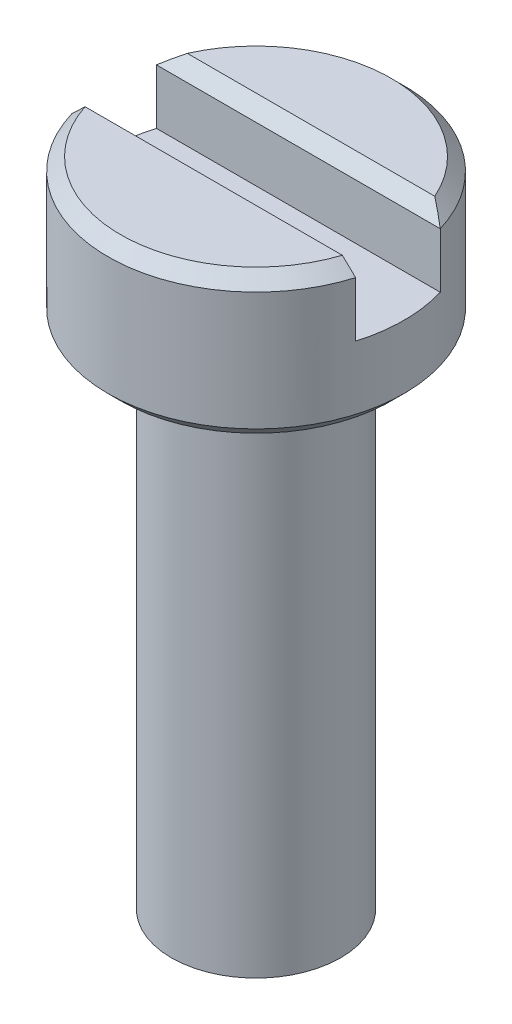
ISO-10303-21;
HEADER;
FILE_DESCRIPTION(('STEP AP214'),'2;1');
FILE_NAME('part.step','',(''),(''),'','','');
FILE_SCHEMA(('AUTOMOTIVE_DESIGN { 1 0 10303 214 1 1 1 1 }'));
ENDSEC;
DATA;
#1=APPLICATION_CONTEXT('core data for automotive mechanical design processes');
#2=APPLICATION_PROTOCOL_DEFINITION('international standard','automotive_design',2000,#1);
#3=PRODUCT_CONTEXT('',#1,'mechanical');
#4=PRODUCT('Part','Part','',(#3));
#5=PRODUCT_RELATED_PRODUCT_CATEGORY('part','',(#4));
#6=PRODUCT_DEFINITION_FORMATION('','',#4);
#7=PRODUCT_DEFINITION_CONTEXT('part definition',#1,'design');
#8=PRODUCT_DEFINITION('design','',#6,#7);
#9=PRODUCT_DEFINITION_SHAPE('','',#8);
#10=(LENGTH_UNIT() NAMED_UNIT(*) SI_UNIT(.MILLI.,.METRE.));
#11=(NAMED_UNIT(*) PLANE_ANGLE_UNIT() SI_UNIT($,.RADIAN.));
#12=(NAMED_UNIT(*) SI_UNIT($,.STERADIAN.) SOLID_ANGLE_UNIT());
#13=UNCERTAINTY_MEASURE_WITH_UNIT(LENGTH_MEASURE(1.E-05),#10,'distance_accuracy_value','');
#14=(GEOMETRIC_REPRESENTATION_CONTEXT(3) GLOBAL_UNCERTAINTY_ASSIGNED_CONTEXT((#13)) GLOBAL_UNIT_ASSIGNED_CONTEXT((#10,
#11,#12)) REPRESENTATION_CONTEXT('',''));
#15=CARTESIAN_POINT('',(0.,0.,0.));
#16=DIRECTION('',(0.,0.,1.));
#17=DIRECTION('',(1.,0.,0.));
#18=AXIS2_PLACEMENT_3D('',#15,#16,#17);
#19=CARTESIAN_POINT('',(0.,1.7,0.));
#20=DIRECTION('',(0.,1.,0.));
#21=DIRECTION('',(0.,0.,1.));
#22=AXIS2_PLACEMENT_3D('',#19,#20,#21);
#23=PLANE('',#22);
#24=DIRECTION('',(1.,0.,0.));
#25=VECTOR('',#24,1.);
#26=CARTESIAN_POINT('',(1.67705098312484,1.7,-0.650000000000001));
#27=LINE('',#26,#25);
#28=CARTESIAN_POINT('',(-1.46201915172134,1.7,-0.65));
#29=VERTEX_POINT('',#28);
#30=CARTESIAN_POINT('',(1.46201915172134,1.7,-0.650000000000001));
#31=VERTEX_POINT('',#30);
#32=EDGE_CURVE('E143',#29,#31,#27,.T.);
#33=ORIENTED_EDGE('',*,*,#32,.T.);
#34=CARTESIAN_POINT('',(0.,1.7,0.));
#35=DIRECTION('',(0.,1.,0.));
#36=DIRECTION('',(0.,0.,1.));
#37=AXIS2_PLACEMENT_3D('',#34,#35,#36);
#38=CIRCLE('',#37,1.6);
#39=EDGE_CURVE('E146',#31,#29,#38,.T.);
#40=ORIENTED_EDGE('',*,*,#39,.T.);
#41=EDGE_LOOP('',(#33,#40));
#42=FACE_BOUND('',#41,.T.);
#43=ADVANCED_FACE('F39',(#42),#23,.T.);
#44=CARTESIAN_POINT('',(0.,1.7,0.));
#45=DIRECTION('',(0.,-1.,0.));
#46=DIRECTION('',(0.,0.,-1.));
#47=AXIS2_PLACEMENT_3D('',#44,#45,#46);
#48=CYLINDRICAL_SURFACE('',#47,1.75);
#49=CARTESIAN_POINT('',(0.,0.149999999999999,0.));
#50=DIRECTION('',(0.,1.,0.));
#51=DIRECTION('',(0.,0.,1.));
#52=AXIS2_PLACEMENT_3D('',#49,#50,#51);
#53=CIRCLE('',#52,1.75);
#54=CARTESIAN_POINT('',(0.,0.149999999999999,1.75));
#55=VERTEX_POINT('',#54);
#56=EDGE_CURVE('E150',#55,#55,#53,.T.);
#57=ORIENTED_EDGE('',*,*,#56,.T.);
#58=EDGE_LOOP('',(#57));
#59=FACE_BOUND('',#58,.T.);
#60=DIRECTION('',(0.,-1.,0.));
#61=VECTOR('',#60,1.);
#62=CARTESIAN_POINT('',(-1.67705098312484,1.7,-0.5));
#63=LINE('',#62,#61);
#64=CARTESIAN_POINT('',(-1.67705098312484,0.9,-0.5));
#65=VERTEX_POINT('',#64);
#66=CARTESIAN_POINT('',(-1.67705098312484,1.55,-0.5));
#67=VERTEX_POINT('',#66);
#68=EDGE_CURVE('E104',#65,#67,#63,.F.);
#69=ORIENTED_EDGE('',*,*,#68,.T.);
#70=CARTESIAN_POINT('',(0.,1.55,0.));
#71=DIRECTION('',(0.,1.,0.));
#72=DIRECTION('',(0.,0.,1.));
#73=AXIS2_PLACEMENT_3D('',#70,#71,#72);
#74=CIRCLE('',#73,1.75);
#75=CARTESIAN_POINT('',(1.67705098312484,1.55,-0.5));
#76=VERTEX_POINT('',#75);
#77=EDGE_CURVE('E156',#67,#76,#74,.F.);
#78=ORIENTED_EDGE('',*,*,#77,.T.);
#79=DIRECTION('',(0.,-1.,0.));
#80=VECTOR('',#79,1.);
#81=CARTESIAN_POINT('',(1.67705098312484,1.7,-0.5));
#82=LINE('',#81,#80);
#83=CARTESIAN_POINT('',(1.67705098312484,0.9,-0.5));
#84=VERTEX_POINT('',#83);
#85=EDGE_CURVE('E134',#76,#84,#82,.T.);
#86=ORIENTED_EDGE('',*,*,#85,.T.);
#87=CARTESIAN_POINT('',(0.,0.9,0.));
#88=DIRECTION('',(0.,1.,0.));
#89=DIRECTION('',(0.,0.,1.));
#90=AXIS2_PLACEMENT_3D('',#87,#88,#89);
#91=CIRCLE('',#90,1.75);
#92=CARTESIAN_POINT('',(1.67705098312484,0.9,0.5));
#93=VERTEX_POINT('',#92);
#94=EDGE_CURVE('E117',#93,#84,#91,.T.);
#95=ORIENTED_EDGE('',*,*,#94,.F.);
#96=DIRECTION('',(0.,-1.,0.));
#97=VECTOR('',#96,1.);
#98=CARTESIAN_POINT('',(1.67705098312484,1.7,0.5));
#99=LINE('',#98,#97);
#100=CARTESIAN_POINT('',(1.67705098312484,1.55,0.5));
#101=VERTEX_POINT('',#100);
#102=EDGE_CURVE('E105',#93,#101,#99,.F.);
#103=ORIENTED_EDGE('',*,*,#102,.T.);
#104=CARTESIAN_POINT('',(0.,1.55,0.));
#105=DIRECTION('',(0.,1.,0.));
#106=DIRECTION('',(0.,0.,1.));
#107=AXIS2_PLACEMENT_3D('',#104,#105,#106);
#108=CIRCLE('',#107,1.75);
#109=CARTESIAN_POINT('',(-1.67705098312484,1.55,0.5));
#110=VERTEX_POINT('',#109);
#111=EDGE_CURVE('E101',#101,#110,#108,.F.);
#112=ORIENTED_EDGE('',*,*,#111,.T.);
#113=DIRECTION('',(0.,-1.,0.));
#114=VECTOR('',#113,1.);
#115=CARTESIAN_POINT('',(-1.67705098312484,1.7,0.5));
#116=LINE('',#115,#114);
#117=CARTESIAN_POINT('',(-1.67705098312484,0.9,0.5));
#118=VERTEX_POINT('',#117);
#119=EDGE_CURVE('E95',#110,#118,#116,.T.);
#120=ORIENTED_EDGE('',*,*,#119,.T.);
#121=EDGE_CURVE('E99',#65,#118,#91,.T.);
#122=ORIENTED_EDGE('',*,*,#121,.F.);
#123=EDGE_LOOP('',(#69,#78,#86,#95,#103,#112,#120,#122));
#124=FACE_BOUND('',#123,.T.);
#125=ADVANCED_FACE('F98',(#59,#124),#48,.T.);
#126=DIRECTION('',(1.,0.,0.));
#127=VECTOR('',#126,1.);
#128=CARTESIAN_POINT('',(0.,1.7,0.5));
#129=LINE('',#128,#127);
#130=CARTESIAN_POINT('',(-1.51986841535707,1.7,0.5));
#131=VERTEX_POINT('',#130);
#132=CARTESIAN_POINT('',(1.51986841535707,1.7,0.5));
#133=VERTEX_POINT('',#132);
#134=EDGE_CURVE('E118',#131,#133,#129,.T.);
#135=ORIENTED_EDGE('',*,*,#134,.F.);
#136=CARTESIAN_POINT('',(0.,1.7,0.));
#137=DIRECTION('',(0.,1.,0.));
#138=DIRECTION('',(0.,0.,1.));
#139=AXIS2_PLACEMENT_3D('',#136,#137,#138);
#140=CIRCLE('',#139,1.6);
#141=EDGE_CURVE('E163',#131,#133,#140,.T.);
#142=ORIENTED_EDGE('',*,*,#141,.T.);
#143=EDGE_LOOP('',(#135,#142));
#144=FACE_BOUND('',#143,.T.);
#145=ADVANCED_FACE('F199',(#144),#23,.T.);
#146=CARTESIAN_POINT('',(0.,0.,0.));
#147=DIRECTION('',(0.,1.,0.));
#148=DIRECTION('',(0.,0.,1.));
#149=AXIS2_PLACEMENT_3D('',#146,#147,#148);
#150=PLANE('',#149);
#151=CARTESIAN_POINT('',(0.,0.,0.));
#152=DIRECTION('',(0.,1.,0.));
#153=DIRECTION('',(0.,0.,1.));
#154=AXIS2_PLACEMENT_3D('',#151,#152,#153);
#155=CIRCLE('',#154,1.2);
#156=CARTESIAN_POINT('',(0.,0.,1.2));
#157=VERTEX_POINT('',#156);
#158=EDGE_CURVE('E11',#157,#157,#155,.T.);
#159=ORIENTED_EDGE('',*,*,#158,.T.);
#160=EDGE_LOOP('',(#159));
#161=FACE_BOUND('',#160,.T.);
#162=CARTESIAN_POINT('',(0.,0.,0.));
#163=DIRECTION('',(0.,1.,0.));
#164=DIRECTION('',(0.,0.,1.));
#165=AXIS2_PLACEMENT_3D('',#162,#163,#164);
#166=CIRCLE('',#165,1.6);
#167=CARTESIAN_POINT('',(0.,0.,1.6));
#168=VERTEX_POINT('',#167);
#169=EDGE_CURVE('E226',#168,#168,#166,.F.);
#170=ORIENTED_EDGE('',*,*,#169,.T.);
#171=EDGE_LOOP('',(#170));
#172=FACE_BOUND('',#171,.T.);
#173=ADVANCED_FACE('F197',(#161,#172),#150,.F.);
#174=CARTESIAN_POINT('',(0.,-6.,0.));
#175=DIRECTION('',(0.,1.,0.));
#176=DIRECTION('',(0.,0.,1.));
#177=AXIS2_PLACEMENT_3D('',#174,#175,#176);
#178=CYLINDRICAL_SURFACE('',#177,1.);
#179=CARTESIAN_POINT('',(0.,-0.2,0.));
#180=DIRECTION('',(0.,1.,0.));
#181=DIRECTION('',(0.,0.,1.));
#182=AXIS2_PLACEMENT_3D('',#179,#180,#181);
#183=CIRCLE('',#182,1.);
#184=CARTESIAN_POINT('',(0.,-0.2,1.));
#185=VERTEX_POINT('',#184);
#186=EDGE_CURVE('E48',#185,#185,#183,.F.);
#187=ORIENTED_EDGE('',*,*,#186,.T.);
#188=EDGE_LOOP('',(#187));
#189=FACE_BOUND('',#188,.T.);
#190=CARTESIAN_POINT('',(0.,-6.,0.));
#191=DIRECTION('',(0.,-1.,0.));
#192=DIRECTION('',(0.,0.,-1.));
#193=AXIS2_PLACEMENT_3D('',#190,#191,#192);
#194=CIRCLE('',#193,1.);
#195=CARTESIAN_POINT('',(0.,-6.,-1.));
#196=VERTEX_POINT('',#195);
#197=EDGE_CURVE('E137',#196,#196,#194,.T.);
#198=ORIENTED_EDGE('',*,*,#197,.F.);
#199=EDGE_LOOP('',(#198));
#200=FACE_BOUND('',#199,.T.);
#201=ADVANCED_FACE('F193',(#189,#200),#178,.T.);
#202=CARTESIAN_POINT('',(0.,-6.,0.));
#203=DIRECTION('',(0.,-1.,0.));
#204=DIRECTION('',(0.,0.,-1.));
#205=AXIS2_PLACEMENT_3D('',#202,#203,#204);
#206=PLANE('',#205);
#207=ORIENTED_EDGE('',*,*,#197,.T.);
#208=EDGE_LOOP('',(#207));
#209=FACE_BOUND('',#208,.T.);
#210=ADVANCED_FACE('F189',(#209),#206,.T.);
#211=CARTESIAN_POINT('',(0.,0.9,0.));
#212=DIRECTION('',(0.,1.,0.));
#213=DIRECTION('',(0.,0.,1.));
#214=AXIS2_PLACEMENT_3D('',#211,#212,#213);
#215=PLANE('',#214);
#216=ORIENTED_EDGE('',*,*,#94,.T.);
#217=DIRECTION('',(-1.,0.,0.));
#218=VECTOR('',#217,1.);
#219=CARTESIAN_POINT('',(2.,0.9,-0.5));
#220=LINE('',#219,#218);
#221=EDGE_CURVE('E115',#84,#65,#220,.T.);
#222=ORIENTED_EDGE('',*,*,#221,.T.);
#223=ORIENTED_EDGE('',*,*,#121,.T.);
#224=DIRECTION('',(1.,0.,0.));
#225=VECTOR('',#224,1.);
#226=CARTESIAN_POINT('',(2.,0.9,0.5));
#227=LINE('',#226,#225);
#228=EDGE_CURVE('E112',#118,#93,#227,.T.);
#229=ORIENTED_EDGE('',*,*,#228,.T.);
#230=EDGE_LOOP('',(#216,#222,#223,#229));
#231=FACE_BOUND('',#230,.T.);
#232=ADVANCED_FACE('F111',(#231),#215,.T.);
#233=CARTESIAN_POINT('',(2.,0.9,-0.5));
#234=DIRECTION('',(0.,0.,-1.));
#235=DIRECTION('',(-1.,0.,0.));
#236=AXIS2_PLACEMENT_3D('',#233,#234,#235);
#237=PLANE('',#236);
#238=ORIENTED_EDGE('',*,*,#85,.F.);
#239=DIRECTION('',(-1.,0.,0.));
#240=VECTOR('',#239,1.);
#241=CARTESIAN_POINT('',(-1.67705098312484,1.55,-0.5));
#242=LINE('',#241,#240);
#243=EDGE_CURVE('E160',#76,#67,#242,.T.);
#244=ORIENTED_EDGE('',*,*,#243,.T.);
#245=ORIENTED_EDGE('',*,*,#68,.F.);
#246=ORIENTED_EDGE('',*,*,#221,.F.);
#247=EDGE_LOOP('',(#238,#244,#245,#246));
#248=FACE_BOUND('',#247,.T.);
#249=ADVANCED_FACE('F187',(#248),#237,.F.);
#250=CARTESIAN_POINT('',(2.,0.9,0.5));
#251=DIRECTION('',(0.,0.,1.));
#252=DIRECTION('',(1.,0.,0.));
#253=AXIS2_PLACEMENT_3D('',#250,#251,#252);
#254=PLANE('',#253);
#255=ORIENTED_EDGE('',*,*,#134,.T.);
#256=CARTESIAN_POINT('',(1.51986841535707,1.7,0.5));
#257=CARTESIAN_POINT('',(1.54612033611115,1.67505744858459,0.5));
#258=CARTESIAN_POINT('',(1.57234484450592,1.65008617220235,0.5));
#259=CARTESIAN_POINT('',(1.62473903375594,1.60008617219616,0.5));
#260=CARTESIAN_POINT('',(1.6509087146171,1.57505744857841,0.5));
#261=CARTESIAN_POINT('',(1.67705098312484,1.55,0.5));
#262=B_SPLINE_CURVE_WITH_KNOTS('',3,(#256,#257,#258,#259,#260,#261),.UNSPECIFIED.,.F.,.F.,(4,2,
4),(0.,0.108635193939861,0.217270376181985),.UNSPECIFIED.);
#263=EDGE_CURVE('E55',#133,#101,#262,.T.);
#264=ORIENTED_EDGE('',*,*,#263,.T.);
#265=ORIENTED_EDGE('',*,*,#102,.F.);
#266=ORIENTED_EDGE('',*,*,#228,.F.);
#267=ORIENTED_EDGE('',*,*,#119,.F.);
#268=CARTESIAN_POINT('',(-1.67705098312484,1.55,0.5));
#269=CARTESIAN_POINT('',(-1.6509087146171,1.57505744857841,0.5));
#270=CARTESIAN_POINT('',(-1.62473903375594,1.60008617219616,0.5));
#271=CARTESIAN_POINT('',(-1.57234484450592,1.65008617220235,0.5));
#272=CARTESIAN_POINT('',(-1.54612033611115,1.67505744858459,0.5));
#273=CARTESIAN_POINT('',(-1.51986841535707,1.7,0.5));
#274=B_SPLINE_CURVE_WITH_KNOTS('',3,(#268,#269,#270,#271,#272,#273),.UNSPECIFIED.,.F.,.F.,(4,2,
4),(0.,0.108635182242124,0.217270376181986),.UNSPECIFIED.);
#275=EDGE_CURVE('E63',#110,#131,#274,.T.);
#276=ORIENTED_EDGE('',*,*,#275,.T.);
#277=EDGE_LOOP('',(#255,#264,#265,#266,#267,#276));
#278=FACE_BOUND('',#277,.T.);
#279=ADVANCED_FACE('F120',(#278),#254,.F.);
#280=CARTESIAN_POINT('',(2.,1.55,-0.5));
#281=DIRECTION('',(0.,0.70710678118655,0.707106781186546));
#282=DIRECTION('',(1.,0.,0.));
#283=AXIS2_PLACEMENT_3D('',#280,#281,#282);
#284=PLANE('',#283);
#285=CARTESIAN_POINT('',(-1.46201915172134,1.7,-0.65));
#286=CARTESIAN_POINT('',(-1.48056011755355,1.68795210254939,-0.637952102549389));
#287=CARTESIAN_POINT('',(-1.49893960709064,1.67578041652918,-0.625780416529184));
#288=CARTESIAN_POINT('',(-1.53538047864728,1.65120865206757,-0.601208652067575));
#289=CARTESIAN_POINT('',(-1.55344195231035,1.63880864160224,-0.58880864160224));
#290=CARTESIAN_POINT('',(-1.58926188849265,1.61379275495365,-0.563792754953649));
#291=CARTESIAN_POINT('',(-1.6070203612042,1.60117688606012,-0.551176886060122));
#292=CARTESIAN_POINT('',(-1.64225004475907,1.57573887272494,-0.525738872724941));
#293=CARTESIAN_POINT('',(-1.65972116987928,1.56291666890702,-0.512916668907017));
#294=CARTESIAN_POINT('',(-1.67705098312491,1.55000000000006,-0.500000000000055));
#295=B_SPLINE_CURVE_WITH_KNOTS('',3,(#285,#286,#287,#288,#289,#290,#291,#292,#293,#294),
.UNSPECIFIED.,.F.,.F.,(4,2,2,2,4),(0.,0.0755405408955493,0.151058944511682,0.22657480281923,
0.30211279509349),.UNSPECIFIED.);
#296=EDGE_CURVE('E127',#67,#29,#295,.F.);
#297=ORIENTED_EDGE('',*,*,#296,.F.);
#298=ORIENTED_EDGE('',*,*,#243,.F.);
#299=CARTESIAN_POINT('',(1.67705098312484,1.55,-0.5));
#300=CARTESIAN_POINT('',(1.65972116987926,1.562916668907,-0.512916668906996));
#301=CARTESIAN_POINT('',(1.64225004475906,1.57573887272493,-0.525738872724935));
#302=CARTESIAN_POINT('',(1.60702036120421,1.60117688606013,-0.551176886060126));
#303=CARTESIAN_POINT('',(1.58926188849266,1.61379275495365,-0.56379275495365));
#304=CARTESIAN_POINT('',(1.55344195231035,1.63880864160224,-0.588808641602238));
#305=CARTESIAN_POINT('',(1.53538047864728,1.65120865206757,-0.601208652067574));
#306=CARTESIAN_POINT('',(1.49893960709064,1.67578041652918,-0.625780416529185));
#307=CARTESIAN_POINT('',(1.48056011755356,1.68795210254939,-0.637952102549391));
#308=CARTESIAN_POINT('',(1.46201915172134,1.7,-0.650000000000002));
#309=B_SPLINE_CURVE_WITH_KNOTS('',3,(#299,#300,#301,#302,#303,#304,#305,#306,#307,#308),
.UNSPECIFIED.,.F.,.F.,(4,2,2,2,4),(0.,0.0755379922742627,0.151053850581812,0.226572254197945,
0.302112795093496),.UNSPECIFIED.);
#310=EDGE_CURVE('E122',#31,#76,#309,.F.);
#311=ORIENTED_EDGE('',*,*,#310,.F.);
#312=ORIENTED_EDGE('',*,*,#32,.F.);
#313=EDGE_LOOP('',(#297,#298,#311,#312));
#314=FACE_BOUND('',#313,.T.);
#315=ADVANCED_FACE('F186',(#314),#284,.T.);
#316=CARTESIAN_POINT('',(0.,1.7,0.));
#317=DIRECTION('',(0.,-1.,0.));
#318=DIRECTION('',(0.,0.,-1.));
#319=AXIS2_PLACEMENT_3D('',#316,#317,#318);
#320=CONICAL_SURFACE('',#319,1.6,0.785398163397451);
#321=ORIENTED_EDGE('',*,*,#310,.T.);
#322=ORIENTED_EDGE('',*,*,#77,.F.);
#323=ORIENTED_EDGE('',*,*,#296,.T.);
#324=ORIENTED_EDGE('',*,*,#39,.F.);
#325=EDGE_LOOP('',(#321,#322,#323,#324));
#326=FACE_BOUND('',#325,.T.);
#327=ADVANCED_FACE('F211',(#326),#320,.T.);
#328=CARTESIAN_POINT('',(0.,1.7,0.));
#329=DIRECTION('',(0.,-1.,0.));
#330=DIRECTION('',(0.,0.,-1.));
#331=AXIS2_PLACEMENT_3D('',#328,#329,#330);
#332=CONICAL_SURFACE('',#331,1.6,0.78539816339745);
#333=ORIENTED_EDGE('',*,*,#275,.F.);
#334=ORIENTED_EDGE('',*,*,#111,.F.);
#335=ORIENTED_EDGE('',*,*,#263,.F.);
#336=ORIENTED_EDGE('',*,*,#141,.F.);
#337=EDGE_LOOP('',(#333,#334,#335,#336));
#338=FACE_BOUND('',#337,.T.);
#339=ADVANCED_FACE('F179',(#338),#332,.T.);
#340=CARTESIAN_POINT('',(0.,0.149999999999999,0.));
#341=DIRECTION('',(0.,1.,0.));
#342=DIRECTION('',(0.,0.,1.));
#343=AXIS2_PLACEMENT_3D('',#340,#341,#342);
#344=CONICAL_SURFACE('',#343,1.75,0.785398163397451);
#345=CARTESIAN_POINT('',(0.,0.,1.6));
#346=CARTESIAN_POINT('',(0.,0.00156250000000001,1.6015625));
#347=CARTESIAN_POINT('',(0.,0.00312499999999998,1.603125));
#348=CARTESIAN_POINT('',(0.,0.00624999999999994,1.60625));
#349=CARTESIAN_POINT('',(0.,0.00781249999999993,1.6078125));
#350=CARTESIAN_POINT('',(0.,0.0109374999999999,1.6109375));
#351=CARTESIAN_POINT('',(0.,0.0124999999999999,1.6125));
#352=CARTESIAN_POINT('',(0.,0.0156249999999999,1.615625));
#353=CARTESIAN_POINT('',(0.,0.0171874999999999,1.6171875));
#354=CARTESIAN_POINT('',(0.,0.0203124999999999,1.6203125));
#355=CARTESIAN_POINT('',(0.,0.0218749999999998,1.621875));
#356=CARTESIAN_POINT('',(0.,0.0249999999999998,1.625));
#357=CARTESIAN_POINT('',(0.,0.0265624999999999,1.6265625));
#358=CARTESIAN_POINT('',(0.,0.0296874999999999,1.6296875));
#359=CARTESIAN_POINT('',(0.,0.0312499999999998,1.63125));
#360=CARTESIAN_POINT('',(0.,0.0343749999999998,1.634375));
#361=CARTESIAN_POINT('',(0.,0.0359374999999998,1.6359375));
#362=CARTESIAN_POINT('',(0.,0.0390624999999998,1.6390625));
#363=CARTESIAN_POINT('',(0.,0.0406249999999998,1.640625));
#364=CARTESIAN_POINT('',(0.,0.0437499999999998,1.64375));
#365=CARTESIAN_POINT('',(0.,0.0453124999999997,1.6453125));
#366=CARTESIAN_POINT('',(0.,0.0484374999999997,1.6484375));
#367=CARTESIAN_POINT('',(0.,0.0499999999999998,1.65));
#368=CARTESIAN_POINT('',(0.,0.0531249999999997,1.653125));
#369=CARTESIAN_POINT('',(0.,0.0546874999999997,1.6546875));
#370=CARTESIAN_POINT('',(0.,0.0578124999999997,1.6578125));
#371=CARTESIAN_POINT('',(0.,0.0593749999999997,1.659375));
#372=CARTESIAN_POINT('',(0.,0.0624999999999997,1.6625));
#373=CARTESIAN_POINT('',(0.,0.0640624999999997,1.6640625));
#374=CARTESIAN_POINT('',(0.,0.0671874999999996,1.6671875));
#375=CARTESIAN_POINT('',(0.,0.0687499999999996,1.66875));
#376=CARTESIAN_POINT('',(0.,0.0718749999999996,1.671875));
#377=CARTESIAN_POINT('',(0.,0.0734374999999997,1.6734375));
#378=CARTESIAN_POINT('',(0.,0.0765624999999996,1.6765625));
#379=CARTESIAN_POINT('',(0.,0.0781249999999996,1.678125));
#380=CARTESIAN_POINT('',(0.,0.0812499999999996,1.68125));
#381=CARTESIAN_POINT('',(0.,0.0828124999999996,1.6828125));
#382=CARTESIAN_POINT('',(0.,0.0859374999999996,1.6859375));
#383=CARTESIAN_POINT('',(0.,0.0874999999999996,1.6875));
#384=CARTESIAN_POINT('',(0.,0.0906249999999995,1.690625));
#385=CARTESIAN_POINT('',(0.,0.0921874999999995,1.6921875));
#386=CARTESIAN_POINT('',(0.,0.0953124999999996,1.6953125));
#387=CARTESIAN_POINT('',(0.,0.0968749999999995,1.696875));
#388=CARTESIAN_POINT('',(0.,0.0999999999999995,1.7));
#389=CARTESIAN_POINT('',(0.,0.101562499999999,1.7015625));
#390=CARTESIAN_POINT('',(0.,0.104687499999999,1.7046875));
#391=CARTESIAN_POINT('',(0.,0.10625,1.70625));
#392=CARTESIAN_POINT('',(0.,0.109375,1.709375));
#393=CARTESIAN_POINT('',(0.,0.110937499999999,1.7109375));
#394=CARTESIAN_POINT('',(0.,0.114062499999999,1.7140625));
#395=CARTESIAN_POINT('',(0.,0.115624999999999,1.715625));
#396=CARTESIAN_POINT('',(0.,0.118749999999999,1.71875));
#397=CARTESIAN_POINT('',(0.,0.120312499999999,1.7203125));
#398=CARTESIAN_POINT('',(0.,0.123437499999999,1.7234375));
#399=CARTESIAN_POINT('',(0.,0.124999999999999,1.725));
#400=CARTESIAN_POINT('',(0.,0.128124999999999,1.728125));
#401=CARTESIAN_POINT('',(0.,0.129687499999999,1.7296875));
#402=CARTESIAN_POINT('',(0.,0.132812499999999,1.7328125));
#403=CARTESIAN_POINT('',(0.,0.134374999999999,1.734375));
#404=CARTESIAN_POINT('',(0.,0.137499999999999,1.7375));
#405=CARTESIAN_POINT('',(0.,0.139062499999999,1.7390625));
#406=CARTESIAN_POINT('',(0.,0.142187499999999,1.7421875));
#407=CARTESIAN_POINT('',(0.,0.143749999999999,1.74375));
#408=CARTESIAN_POINT('',(0.,0.146874999999999,1.746875));
#409=CARTESIAN_POINT('',(0.,0.148437499999999,1.7484375));
#410=CARTESIAN_POINT('',(0.,0.149999999999999,1.75));
#411=B_SPLINE_CURVE_WITH_KNOTS('',3,(#345,#346,#347,#348,#349,#350,#351,#352,#353,#354,#355,
#356,#357,#358,#359,#360,#361,#362,#363,#364,#365,#366,#367,#368,#369,#370,#371,#372,#373,#374,
#375,#376,#377,#378,#379,#380,#381,#382,#383,#384,#385,#386,#387,#388,#389,#390,#391,#392,#393,
#394,#395,#396,#397,#398,#399,#400,#401,#402,#403,#404,#405,#406,#407,#408,#409,#410),
.UNSPECIFIED.,.F.,.F.,(4,2,2,2,2,2,2,2,2,2,2,2,2,2,2,2,2,2,2,2,2,2,2,2,2,2,2,2,2,2,2,2,4),(0.,
0.0066291260736238,0.0132582521472478,0.0198873782208716,0.0265165042944954,0.0331456303681193,
0.0397747564417432,0.0464038825153671,0.0530330085889909,0.0596621346626147,0.0662912607362387,
0.0729203868098625,0.0795495128834865,0.0861786389571103,0.0928077650307343,0.0994368911043581,
0.106066017177982,0.112695143251606,0.11932426932523,0.125953395398854,0.132582521472477,
0.139211647546101,0.145840773619725,0.152469899693349,0.159099025766973,0.165728151840597,
0.172357277914221,0.178986403987845,0.185615530061468,0.192244656135092,0.198873782208716,
0.20550290828234,0.212132034355964),.UNSPECIFIED.);
#412=EDGE_CURVE('BSEAM234',#168,#55,#411,.T.);
#413=ORIENTED_EDGE('',*,*,#169,.F.);
#414=ORIENTED_EDGE('',*,*,#56,.F.);
#415=ORIENTED_EDGE('',*,*,#412,.T.);
#416=ORIENTED_EDGE('',*,*,#412,.F.);
#417=EDGE_LOOP('',(#413,#415,#414,#416));
#418=FACE_BOUND('',#417,.T.);
#419=ADVANCED_FACE('F234',(#418),#344,.T.);
#420=CARTESIAN_POINT('',(0.,-0.2,0.));
#421=DIRECTION('',(0.,1.,0.));
#422=DIRECTION('',(0.,0.,1.));
#423=AXIS2_PLACEMENT_3D('',#420,#421,#422);
#424=TOROIDAL_SURFACE('',#423,1.2,0.2);
#425=ORIENTED_EDGE('',*,*,#158,.F.);
#426=EDGE_LOOP('',(#425));
#427=FACE_BOUND('',#426,.T.);
#428=ORIENTED_EDGE('',*,*,#186,.F.);
#429=EDGE_LOOP('',(#428));
#430=FACE_BOUND('',#429,.T.);
#431=ADVANCED_FACE('F41',(#427,#430),#424,.F.);
#432=CLOSED_SHELL('',(#43,#125,#145,#173,#201,#210,#232,#249,#279,#315,#327,#339,#419,#431));
#433=MANIFOLD_SOLID_BREP('B2',#432);
#434=ADVANCED_BREP_SHAPE_REPRESENTATION('',(#18,#433),#14);
#435=SHAPE_DEFINITION_REPRESENTATION(#9,#434);
ENDSEC;
END-ISO-10303-21;
